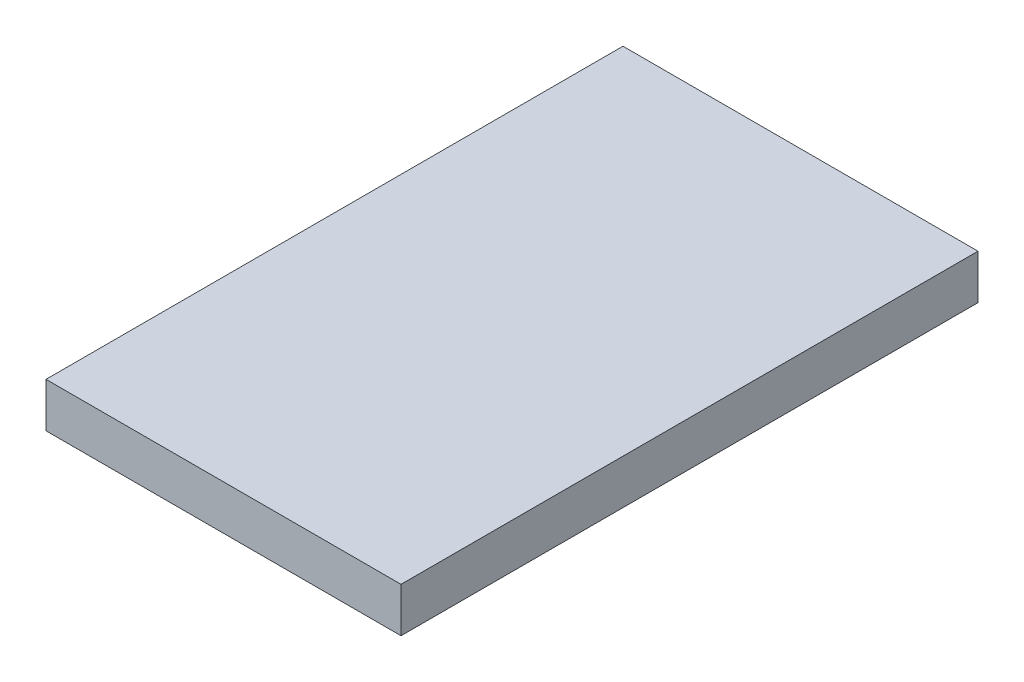
ISO-10303-21;
HEADER;
FILE_DESCRIPTION(('STEP AP214'),'2;1');
FILE_NAME('part.step','',(''),(''),'','','');
FILE_SCHEMA(('AUTOMOTIVE_DESIGN { 1 0 10303 214 1 1 1 1 }'));
ENDSEC;
DATA;
#1=APPLICATION_CONTEXT('core data for automotive mechanical design processes');
#2=APPLICATION_PROTOCOL_DEFINITION('international standard','automotive_design',2000,#1);
#3=PRODUCT_CONTEXT('',#1,'mechanical');
#4=PRODUCT('Part','Part','',(#3));
#5=PRODUCT_RELATED_PRODUCT_CATEGORY('part','',(#4));
#6=PRODUCT_DEFINITION_FORMATION('','',#4);
#7=PRODUCT_DEFINITION_CONTEXT('part definition',#1,'design');
#8=PRODUCT_DEFINITION('design','',#6,#7);
#9=PRODUCT_DEFINITION_SHAPE('','',#8);
#10=(LENGTH_UNIT() NAMED_UNIT(*) SI_UNIT(.MILLI.,.METRE.));
#11=(NAMED_UNIT(*) PLANE_ANGLE_UNIT() SI_UNIT($,.RADIAN.));
#12=(NAMED_UNIT(*) SI_UNIT($,.STERADIAN.) SOLID_ANGLE_UNIT());
#13=UNCERTAINTY_MEASURE_WITH_UNIT(LENGTH_MEASURE(1.E-05),#10,'distance_accuracy_value','');
#14=(GEOMETRIC_REPRESENTATION_CONTEXT(3) GLOBAL_UNCERTAINTY_ASSIGNED_CONTEXT((#13)) GLOBAL_UNIT_ASSIGNED_CONTEXT((#10,
#11,#12)) REPRESENTATION_CONTEXT('',''));
#15=CARTESIAN_POINT('',(0.,0.,0.));
#16=DIRECTION('',(0.,0.,1.));
#17=DIRECTION('',(1.,0.,0.));
#18=AXIS2_PLACEMENT_3D('',#15,#16,#17);
#19=CARTESIAN_POINT('',(23.0918516114891,2.5,-4.54600760103582));
#20=DIRECTION('',(1.,0.,0.));
#21=DIRECTION('',(0.,0.,-1.));
#22=AXIS2_PLACEMENT_3D('',#19,#20,#21);
#23=PLANE('',#22);
#24=DIRECTION('',(0.,0.,1.));
#25=VECTOR('',#24,1.);
#26=CARTESIAN_POINT('',(23.0918516114891,0.,-4.54600760103582));
#27=LINE('',#26,#25);
#28=CARTESIAN_POINT('',(23.0918516114891,0.,-36.900289619096));
#29=VERTEX_POINT('',#28);
#30=CARTESIAN_POINT('',(23.0918516114891,0.,-4.54600760103582));
#31=VERTEX_POINT('',#30);
#32=EDGE_CURVE('E80',#29,#31,#27,.T.);
#33=ORIENTED_EDGE('',*,*,#32,.T.);
#34=DIRECTION('',(0.,-1.,0.));
#35=VECTOR('',#34,1.);
#36=CARTESIAN_POINT('',(23.0918516114891,2.5,-4.54600760103582));
#37=LINE('',#36,#35);
#38=CARTESIAN_POINT('',(23.0918516114891,2.5,-4.54600760103582));
#39=VERTEX_POINT('',#38);
#40=EDGE_CURVE('E11',#39,#31,#37,.T.);
#41=ORIENTED_EDGE('',*,*,#40,.F.);
#42=DIRECTION('',(0.,0.,1.));
#43=VECTOR('',#42,1.);
#44=CARTESIAN_POINT('',(23.0918516114891,2.5,-4.54600760103582));
#45=LINE('',#44,#43);
#46=CARTESIAN_POINT('',(23.0918516114891,2.5,-36.900289619096));
#47=VERTEX_POINT('',#46);
#48=EDGE_CURVE('E68',#47,#39,#45,.T.);
#49=ORIENTED_EDGE('',*,*,#48,.F.);
#50=DIRECTION('',(0.,-1.,0.));
#51=VECTOR('',#50,1.);
#52=CARTESIAN_POINT('',(23.0918516114891,2.5,-36.900289619096));
#53=LINE('',#52,#51);
#54=EDGE_CURVE('E76',#47,#29,#53,.T.);
#55=ORIENTED_EDGE('',*,*,#54,.T.);
#56=EDGE_LOOP('',(#33,#41,#49,#55));
#57=FACE_BOUND('',#56,.T.);
#58=ADVANCED_FACE('F17',(#57),#23,.F.);
#59=CARTESIAN_POINT('',(23.0918516114891,2.5,-4.54600760103582));
#60=DIRECTION('',(0.,0.,-1.));
#61=DIRECTION('',(-1.,0.,0.));
#62=AXIS2_PLACEMENT_3D('',#59,#60,#61);
#63=PLANE('',#62);
#64=DIRECTION('',(1.,0.,0.));
#65=VECTOR('',#64,1.);
#66=CARTESIAN_POINT('',(23.0918516114891,0.,-4.54600760103582));
#67=LINE('',#66,#65);
#68=CARTESIAN_POINT('',(43.,0.,-4.54600760103582));
#69=VERTEX_POINT('',#68);
#70=EDGE_CURVE('E72',#31,#69,#67,.T.);
#71=ORIENTED_EDGE('',*,*,#70,.T.);
#72=DIRECTION('',(0.,-1.,0.));
#73=VECTOR('',#72,1.);
#74=CARTESIAN_POINT('',(43.,2.5,-4.54600760103582));
#75=LINE('',#74,#73);
#76=CARTESIAN_POINT('',(43.,2.5,-4.54600760103582));
#77=VERTEX_POINT('',#76);
#78=EDGE_CURVE('E25',#77,#69,#75,.T.);
#79=ORIENTED_EDGE('',*,*,#78,.F.);
#80=DIRECTION('',(1.,0.,0.));
#81=VECTOR('',#80,1.);
#82=CARTESIAN_POINT('',(23.0918516114891,2.5,-4.54600760103582));
#83=LINE('',#82,#81);
#84=EDGE_CURVE('E63',#39,#77,#83,.T.);
#85=ORIENTED_EDGE('',*,*,#84,.F.);
#86=ORIENTED_EDGE('',*,*,#40,.T.);
#87=EDGE_LOOP('',(#71,#79,#85,#86));
#88=FACE_BOUND('',#87,.T.);
#89=ADVANCED_FACE('F71',(#88),#63,.F.);
#90=CARTESIAN_POINT('',(43.,2.5,-4.54600760103582));
#91=DIRECTION('',(-1.,0.,0.));
#92=DIRECTION('',(0.,0.,1.));
#93=AXIS2_PLACEMENT_3D('',#90,#91,#92);
#94=PLANE('',#93);
#95=DIRECTION('',(0.,0.,-1.));
#96=VECTOR('',#95,1.);
#97=CARTESIAN_POINT('',(43.,0.,-4.54600760103582));
#98=LINE('',#97,#96);
#99=CARTESIAN_POINT('',(43.,0.,-36.900289619096));
#100=VERTEX_POINT('',#99);
#101=EDGE_CURVE('E50',#69,#100,#98,.T.);
#102=ORIENTED_EDGE('',*,*,#101,.T.);
#103=DIRECTION('',(0.,-1.,0.));
#104=VECTOR('',#103,1.);
#105=CARTESIAN_POINT('',(43.,2.5,-36.900289619096));
#106=LINE('',#105,#104);
#107=CARTESIAN_POINT('',(43.,2.5,-36.900289619096));
#108=VERTEX_POINT('',#107);
#109=EDGE_CURVE('E73',#108,#100,#106,.T.);
#110=ORIENTED_EDGE('',*,*,#109,.F.);
#111=DIRECTION('',(0.,0.,-1.));
#112=VECTOR('',#111,1.);
#113=CARTESIAN_POINT('',(43.,2.5,-4.54600760103582));
#114=LINE('',#113,#112);
#115=EDGE_CURVE('E66',#77,#108,#114,.T.);
#116=ORIENTED_EDGE('',*,*,#115,.F.);
#117=ORIENTED_EDGE('',*,*,#78,.T.);
#118=EDGE_LOOP('',(#102,#110,#116,#117));
#119=FACE_BOUND('',#118,.T.);
#120=ADVANCED_FACE('F74',(#119),#94,.F.);
#121=CARTESIAN_POINT('',(23.0918516114891,2.5,-36.900289619096));
#122=DIRECTION('',(0.,0.,1.));
#123=DIRECTION('',(1.,0.,0.));
#124=AXIS2_PLACEMENT_3D('',#121,#122,#123);
#125=PLANE('',#124);
#126=DIRECTION('',(-1.,0.,0.));
#127=VECTOR('',#126,1.);
#128=CARTESIAN_POINT('',(23.0918516114891,0.,-36.900289619096));
#129=LINE('',#128,#127);
#130=EDGE_CURVE('E56',#100,#29,#129,.T.);
#131=ORIENTED_EDGE('',*,*,#130,.T.);
#132=ORIENTED_EDGE('',*,*,#54,.F.);
#133=DIRECTION('',(-1.,0.,0.));
#134=VECTOR('',#133,1.);
#135=CARTESIAN_POINT('',(23.0918516114891,2.5,-36.900289619096));
#136=LINE('',#135,#134);
#137=EDGE_CURVE('E33',#108,#47,#136,.T.);
#138=ORIENTED_EDGE('',*,*,#137,.F.);
#139=ORIENTED_EDGE('',*,*,#109,.T.);
#140=EDGE_LOOP('',(#131,#132,#138,#139));
#141=FACE_BOUND('',#140,.T.);
#142=ADVANCED_FACE('F87',(#141),#125,.F.);
#143=CARTESIAN_POINT('',(0.,2.5,0.));
#144=DIRECTION('',(0.,-1.,0.));
#145=DIRECTION('',(0.,0.,-1.));
#146=AXIS2_PLACEMENT_3D('',#143,#144,#145);
#147=PLANE('',#146);
#148=ORIENTED_EDGE('',*,*,#48,.T.);
#149=ORIENTED_EDGE('',*,*,#84,.T.);
#150=ORIENTED_EDGE('',*,*,#115,.T.);
#151=ORIENTED_EDGE('',*,*,#137,.T.);
#152=EDGE_LOOP('',(#148,#149,#150,#151));
#153=FACE_BOUND('',#152,.T.);
#154=ADVANCED_FACE('F64',(#153),#147,.F.);
#155=CARTESIAN_POINT('',(0.,0.,0.));
#156=DIRECTION('',(0.,-1.,0.));
#157=DIRECTION('',(0.,0.,-1.));
#158=AXIS2_PLACEMENT_3D('',#155,#156,#157);
#159=PLANE('',#158);
#160=ORIENTED_EDGE('',*,*,#32,.F.);
#161=ORIENTED_EDGE('',*,*,#130,.F.);
#162=ORIENTED_EDGE('',*,*,#101,.F.);
#163=ORIENTED_EDGE('',*,*,#70,.F.);
#164=EDGE_LOOP('',(#160,#161,#162,#163));
#165=FACE_BOUND('',#164,.T.);
#166=ADVANCED_FACE('F90',(#165),#159,.T.);
#167=CLOSED_SHELL('',(#58,#89,#120,#142,#154,#166));
#168=MANIFOLD_SOLID_BREP('B1',#167);
#169=ADVANCED_BREP_SHAPE_REPRESENTATION('',(#18,#168),#14);
#170=SHAPE_DEFINITION_REPRESENTATION(#9,#169);
ENDSEC;
END-ISO-10303-21;
